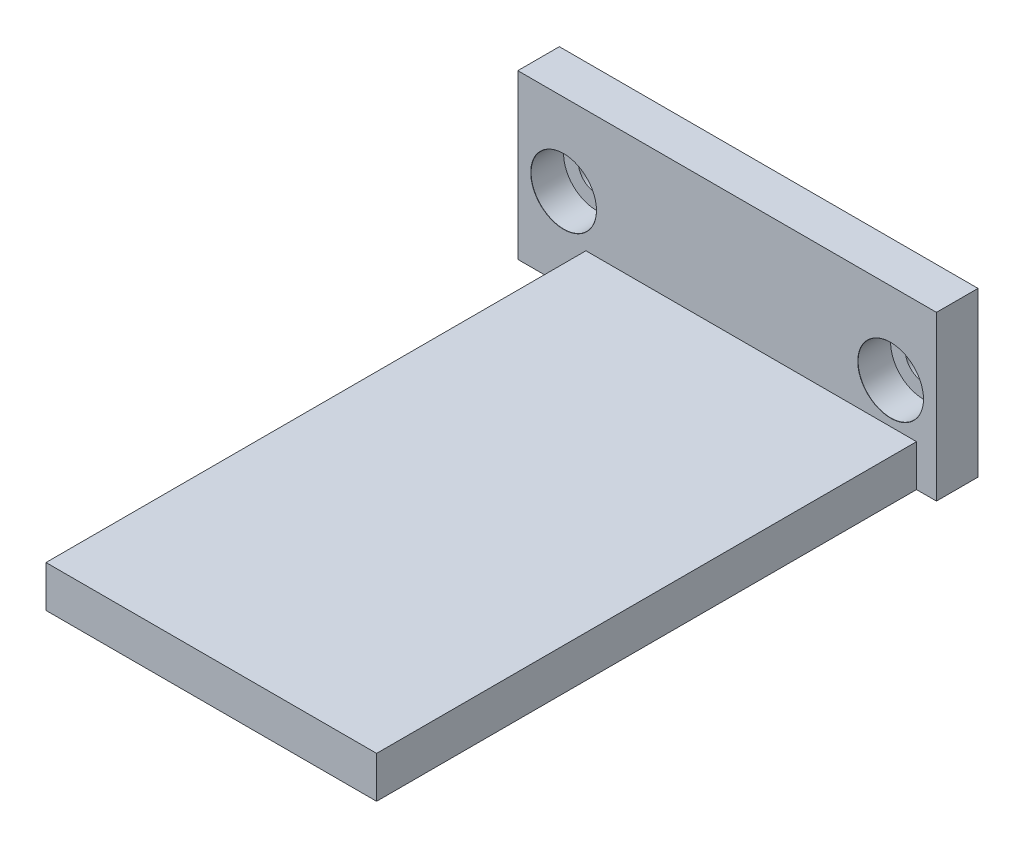
ISO-10303-21;
HEADER;
FILE_DESCRIPTION(('STEP AP214'),'2;1');
FILE_NAME('part.step','',(''),(''),'','','');
FILE_SCHEMA(('AUTOMOTIVE_DESIGN { 1 0 10303 214 1 1 1 1 }'));
ENDSEC;
DATA;
#1=APPLICATION_CONTEXT('core data for automotive mechanical design processes');
#2=APPLICATION_PROTOCOL_DEFINITION('international standard','automotive_design',2000,#1);
#3=PRODUCT_CONTEXT('',#1,'mechanical');
#4=PRODUCT('Part','Part','',(#3));
#5=PRODUCT_RELATED_PRODUCT_CATEGORY('part','',(#4));
#6=PRODUCT_DEFINITION_FORMATION('','',#4);
#7=PRODUCT_DEFINITION_CONTEXT('part definition',#1,'design');
#8=PRODUCT_DEFINITION('design','',#6,#7);
#9=PRODUCT_DEFINITION_SHAPE('','',#8);
#10=(LENGTH_UNIT() NAMED_UNIT(*) SI_UNIT(.MILLI.,.METRE.));
#11=(NAMED_UNIT(*) PLANE_ANGLE_UNIT() SI_UNIT($,.RADIAN.));
#12=(NAMED_UNIT(*) SI_UNIT($,.STERADIAN.) SOLID_ANGLE_UNIT());
#13=UNCERTAINTY_MEASURE_WITH_UNIT(LENGTH_MEASURE(1.E-05),#10,'distance_accuracy_value','');
#14=(GEOMETRIC_REPRESENTATION_CONTEXT(3) GLOBAL_UNCERTAINTY_ASSIGNED_CONTEXT((#13)) GLOBAL_UNIT_ASSIGNED_CONTEXT((#10,
#11,#12)) REPRESENTATION_CONTEXT('',''));
#15=CARTESIAN_POINT('',(0.,0.,0.));
#16=DIRECTION('',(0.,0.,1.));
#17=DIRECTION('',(1.,0.,0.));
#18=AXIS2_PLACEMENT_3D('',#15,#16,#17);
#19=CARTESIAN_POINT('',(0.,0.,6.35));
#20=DIRECTION('',(0.,0.,-1.));
#21=DIRECTION('',(-1.,0.,0.));
#22=AXIS2_PLACEMENT_3D('',#19,#20,#21);
#23=PLANE('',#22);
#24=CARTESIAN_POINT('',(7.,12.5,6.35));
#25=DIRECTION('',(0.,0.,1.));
#26=DIRECTION('',(1.,0.,0.));
#27=AXIS2_PLACEMENT_3D('',#24,#25,#26);
#28=CIRCLE('',#27,5.025);
#29=CARTESIAN_POINT('',(12.025,12.5,6.35));
#30=VERTEX_POINT('',#29);
#31=EDGE_CURVE('E177',#30,#30,#28,.T.);
#32=ORIENTED_EDGE('',*,*,#31,.F.);
#33=EDGE_LOOP('',(#32));
#34=FACE_BOUND('',#33,.T.);
#35=CARTESIAN_POINT('',(57.,12.5,6.35));
#36=DIRECTION('',(0.,0.,1.));
#37=DIRECTION('',(1.,0.,0.));
#38=AXIS2_PLACEMENT_3D('',#35,#36,#37);
#39=CIRCLE('',#38,5.025);
#40=CARTESIAN_POINT('',(62.025,12.5,6.35));
#41=VERTEX_POINT('',#40);
#42=EDGE_CURVE('E162',#41,#41,#39,.T.);
#43=ORIENTED_EDGE('',*,*,#42,.F.);
#44=EDGE_LOOP('',(#43));
#45=FACE_BOUND('',#44,.T.);
#46=DIRECTION('',(-1.,0.,0.));
#47=VECTOR('',#46,1.);
#48=CARTESIAN_POINT('',(0.,6.35,6.35));
#49=LINE('',#48,#47);
#50=CARTESIAN_POINT('',(60.96,6.35,6.35));
#51=VERTEX_POINT('',#50);
#52=CARTESIAN_POINT('',(10.414,6.35,6.35));
#53=VERTEX_POINT('',#52);
#54=EDGE_CURVE('E144',#51,#53,#49,.T.);
#55=ORIENTED_EDGE('',*,*,#54,.F.);
#56=DIRECTION('',(0.,1.,0.));
#57=VECTOR('',#56,1.);
#58=CARTESIAN_POINT('',(60.96,0.,6.35));
#59=LINE('',#58,#57);
#60=CARTESIAN_POINT('',(60.96,0.,6.35));
#61=VERTEX_POINT('',#60);
#62=EDGE_CURVE('E118',#61,#51,#59,.T.);
#63=ORIENTED_EDGE('',*,*,#62,.F.);
#64=DIRECTION('',(-1.,0.,0.));
#65=VECTOR('',#64,1.);
#66=CARTESIAN_POINT('',(64.008,0.,6.35));
#67=LINE('',#66,#65);
#68=CARTESIAN_POINT('',(64.008,0.,6.35));
#69=VERTEX_POINT('',#68);
#70=EDGE_CURVE('E116',#69,#61,#67,.T.);
#71=ORIENTED_EDGE('',*,*,#70,.F.);
#72=DIRECTION('',(0.,1.,0.));
#73=VECTOR('',#72,1.);
#74=CARTESIAN_POINT('',(64.008,0.,6.35));
#75=LINE('',#74,#73);
#76=CARTESIAN_POINT('',(64.008,24.9936,6.35));
#77=VERTEX_POINT('',#76);
#78=EDGE_CURVE('E103',#69,#77,#75,.T.);
#79=ORIENTED_EDGE('',*,*,#78,.T.);
#80=DIRECTION('',(-1.,0.,0.));
#81=VECTOR('',#80,1.);
#82=CARTESIAN_POINT('',(0.,24.9936,6.35));
#83=LINE('',#82,#81);
#84=CARTESIAN_POINT('',(0.,24.9936,6.35));
#85=VERTEX_POINT('',#84);
#86=EDGE_CURVE('E112',#77,#85,#83,.T.);
#87=ORIENTED_EDGE('',*,*,#86,.T.);
#88=DIRECTION('',(0.,-1.,0.));
#89=VECTOR('',#88,1.);
#90=CARTESIAN_POINT('',(0.,0.,6.35));
#91=LINE('',#90,#89);
#92=CARTESIAN_POINT('',(0.,0.,6.35));
#93=VERTEX_POINT('',#92);
#94=EDGE_CURVE('E113',#85,#93,#91,.T.);
#95=ORIENTED_EDGE('',*,*,#94,.T.);
#96=DIRECTION('',(-1.,0.,0.));
#97=VECTOR('',#96,1.);
#98=CARTESIAN_POINT('',(0.,0.,6.35));
#99=LINE('',#98,#97);
#100=CARTESIAN_POINT('',(10.414,0.,6.35));
#101=VERTEX_POINT('',#100);
#102=EDGE_CURVE('E183',#101,#93,#99,.T.);
#103=ORIENTED_EDGE('',*,*,#102,.F.);
#104=DIRECTION('',(0.,1.,0.));
#105=VECTOR('',#104,1.);
#106=CARTESIAN_POINT('',(10.414,0.,6.35));
#107=LINE('',#106,#105);
#108=EDGE_CURVE('E180',#101,#53,#107,.T.);
#109=ORIENTED_EDGE('',*,*,#108,.T.);
#110=EDGE_LOOP('',(#55,#63,#71,#79,#87,#95,#103,#109));
#111=FACE_BOUND('',#110,.T.);
#112=ADVANCED_FACE('F39',(#34,#45,#111),#23,.F.);
#113=CARTESIAN_POINT('',(0.,0.,6.35));
#114=DIRECTION('',(1.,0.,0.));
#115=DIRECTION('',(0.,0.,-1.));
#116=AXIS2_PLACEMENT_3D('',#113,#114,#115);
#117=PLANE('',#116);
#118=DIRECTION('',(0.,0.,-1.));
#119=VECTOR('',#118,1.);
#120=CARTESIAN_POINT('',(0.,0.,6.35));
#121=LINE('',#120,#119);
#122=CARTESIAN_POINT('',(0.,0.,0.));
#123=VERTEX_POINT('',#122);
#124=EDGE_CURVE('E11',#93,#123,#121,.T.);
#125=ORIENTED_EDGE('',*,*,#124,.F.);
#126=ORIENTED_EDGE('',*,*,#94,.F.);
#127=DIRECTION('',(0.,0.,-1.));
#128=VECTOR('',#127,1.);
#129=CARTESIAN_POINT('',(0.,24.9936,6.35));
#130=LINE('',#129,#128);
#131=CARTESIAN_POINT('',(0.,24.9936,0.));
#132=VERTEX_POINT('',#131);
#133=EDGE_CURVE('E128',#85,#132,#130,.T.);
#134=ORIENTED_EDGE('',*,*,#133,.T.);
#135=DIRECTION('',(0.,-1.,0.));
#136=VECTOR('',#135,1.);
#137=CARTESIAN_POINT('',(0.,0.,0.));
#138=LINE('',#137,#136);
#139=EDGE_CURVE('E138',#132,#123,#138,.T.);
#140=ORIENTED_EDGE('',*,*,#139,.T.);
#141=EDGE_LOOP('',(#125,#126,#134,#140));
#142=FACE_BOUND('',#141,.T.);
#143=ADVANCED_FACE('F41',(#142),#117,.F.);
#144=CARTESIAN_POINT('',(0.,0.,6.35));
#145=DIRECTION('',(0.,1.,0.));
#146=DIRECTION('',(0.,0.,1.));
#147=AXIS2_PLACEMENT_3D('',#144,#145,#146);
#148=PLANE('',#147);
#149=ORIENTED_EDGE('',*,*,#70,.T.);
#150=DIRECTION('',(0.,0.,1.));
#151=VECTOR('',#150,1.);
#152=CARTESIAN_POINT('',(60.96,0.,88.9));
#153=LINE('',#152,#151);
#154=CARTESIAN_POINT('',(60.96,0.,88.9));
#155=VERTEX_POINT('',#154);
#156=EDGE_CURVE('E122',#61,#155,#153,.T.);
#157=ORIENTED_EDGE('',*,*,#156,.T.);
#158=DIRECTION('',(1.,0.,0.));
#159=VECTOR('',#158,1.);
#160=CARTESIAN_POINT('',(0.,0.,88.9));
#161=LINE('',#160,#159);
#162=CARTESIAN_POINT('',(10.414,0.,88.9));
#163=VERTEX_POINT('',#162);
#164=EDGE_CURVE('E146',#163,#155,#161,.T.);
#165=ORIENTED_EDGE('',*,*,#164,.F.);
#166=DIRECTION('',(0.,0.,-1.));
#167=VECTOR('',#166,1.);
#168=CARTESIAN_POINT('',(10.414,0.,88.9));
#169=LINE('',#168,#167);
#170=EDGE_CURVE('E62',#163,#101,#169,.T.);
#171=ORIENTED_EDGE('',*,*,#170,.T.);
#172=ORIENTED_EDGE('',*,*,#102,.T.);
#173=ORIENTED_EDGE('',*,*,#124,.T.);
#174=DIRECTION('',(1.,0.,0.));
#175=VECTOR('',#174,1.);
#176=CARTESIAN_POINT('',(0.,0.,0.));
#177=LINE('',#176,#175);
#178=CARTESIAN_POINT('',(64.008,0.,0.));
#179=VERTEX_POINT('',#178);
#180=EDGE_CURVE('E126',#123,#179,#177,.T.);
#181=ORIENTED_EDGE('',*,*,#180,.T.);
#182=DIRECTION('',(0.,0.,-1.));
#183=VECTOR('',#182,1.);
#184=CARTESIAN_POINT('',(64.008,0.,6.35));
#185=LINE('',#184,#183);
#186=EDGE_CURVE('E47',#69,#179,#185,.T.);
#187=ORIENTED_EDGE('',*,*,#186,.F.);
#188=EDGE_LOOP('',(#149,#157,#165,#171,#172,#173,#181,#187));
#189=FACE_BOUND('',#188,.T.);
#190=ADVANCED_FACE('F124',(#189),#148,.F.);
#191=CARTESIAN_POINT('',(64.008,0.,6.35));
#192=DIRECTION('',(-1.,0.,0.));
#193=DIRECTION('',(0.,0.,1.));
#194=AXIS2_PLACEMENT_3D('',#191,#192,#193);
#195=PLANE('',#194);
#196=ORIENTED_EDGE('',*,*,#78,.F.);
#197=ORIENTED_EDGE('',*,*,#186,.T.);
#198=DIRECTION('',(0.,1.,0.));
#199=VECTOR('',#198,1.);
#200=CARTESIAN_POINT('',(64.008,0.,0.));
#201=LINE('',#200,#199);
#202=CARTESIAN_POINT('',(64.008,24.9936,0.));
#203=VERTEX_POINT('',#202);
#204=EDGE_CURVE('E135',#179,#203,#201,.T.);
#205=ORIENTED_EDGE('',*,*,#204,.T.);
#206=DIRECTION('',(0.,0.,-1.));
#207=VECTOR('',#206,1.);
#208=CARTESIAN_POINT('',(64.008,24.9936,6.35));
#209=LINE('',#208,#207);
#210=EDGE_CURVE('E109',#77,#203,#209,.T.);
#211=ORIENTED_EDGE('',*,*,#210,.F.);
#212=EDGE_LOOP('',(#196,#197,#205,#211));
#213=FACE_BOUND('',#212,.T.);
#214=ADVANCED_FACE('F105',(#213),#195,.F.);
#215=CARTESIAN_POINT('',(0.,24.9936,6.35));
#216=DIRECTION('',(0.,-1.,0.));
#217=DIRECTION('',(0.,0.,-1.));
#218=AXIS2_PLACEMENT_3D('',#215,#216,#217);
#219=PLANE('',#218);
#220=DIRECTION('',(-1.,0.,0.));
#221=VECTOR('',#220,1.);
#222=CARTESIAN_POINT('',(0.,24.9936,0.));
#223=LINE('',#222,#221);
#224=EDGE_CURVE('E133',#203,#132,#223,.T.);
#225=ORIENTED_EDGE('',*,*,#224,.T.);
#226=ORIENTED_EDGE('',*,*,#133,.F.);
#227=ORIENTED_EDGE('',*,*,#86,.F.);
#228=ORIENTED_EDGE('',*,*,#210,.T.);
#229=EDGE_LOOP('',(#225,#226,#227,#228));
#230=FACE_BOUND('',#229,.T.);
#231=ADVANCED_FACE('F214',(#230),#219,.F.);
#232=CARTESIAN_POINT('',(0.,0.,0.));
#233=DIRECTION('',(0.,0.,-1.));
#234=DIRECTION('',(-1.,0.,0.));
#235=AXIS2_PLACEMENT_3D('',#232,#233,#234);
#236=PLANE('',#235);
#237=CARTESIAN_POINT('',(7.,12.5,0.));
#238=DIRECTION('',(0.,0.,-1.));
#239=DIRECTION('',(-1.,0.,0.));
#240=AXIS2_PLACEMENT_3D('',#237,#238,#239);
#241=CIRCLE('',#240,2.75);
#242=CARTESIAN_POINT('',(4.25,12.5,0.));
#243=VERTEX_POINT('',#242);
#244=EDGE_CURVE('E165',#243,#243,#241,.T.);
#245=ORIENTED_EDGE('',*,*,#244,.F.);
#246=EDGE_LOOP('',(#245));
#247=FACE_BOUND('',#246,.T.);
#248=CARTESIAN_POINT('',(57.,12.5,0.));
#249=DIRECTION('',(0.,0.,-1.));
#250=DIRECTION('',(-1.,0.,0.));
#251=AXIS2_PLACEMENT_3D('',#248,#249,#250);
#252=CIRCLE('',#251,2.75);
#253=CARTESIAN_POINT('',(54.25,12.5,0.));
#254=VERTEX_POINT('',#253);
#255=EDGE_CURVE('E147',#254,#254,#252,.T.);
#256=ORIENTED_EDGE('',*,*,#255,.F.);
#257=EDGE_LOOP('',(#256));
#258=FACE_BOUND('',#257,.T.);
#259=ORIENTED_EDGE('',*,*,#139,.F.);
#260=ORIENTED_EDGE('',*,*,#224,.F.);
#261=ORIENTED_EDGE('',*,*,#204,.F.);
#262=ORIENTED_EDGE('',*,*,#180,.F.);
#263=EDGE_LOOP('',(#259,#260,#261,#262));
#264=FACE_BOUND('',#263,.T.);
#265=ADVANCED_FACE('F212',(#247,#258,#264),#236,.T.);
#266=CARTESIAN_POINT('',(0.,6.35,88.9));
#267=DIRECTION('',(0.,-1.,0.));
#268=DIRECTION('',(0.,0.,-1.));
#269=AXIS2_PLACEMENT_3D('',#266,#267,#268);
#270=PLANE('',#269);
#271=DIRECTION('',(-1.,0.,0.));
#272=VECTOR('',#271,1.);
#273=CARTESIAN_POINT('',(0.,6.35,88.9));
#274=LINE('',#273,#272);
#275=CARTESIAN_POINT('',(60.96,6.35,88.9));
#276=VERTEX_POINT('',#275);
#277=CARTESIAN_POINT('',(10.414,6.35,88.9));
#278=VERTEX_POINT('',#277);
#279=EDGE_CURVE('E141',#276,#278,#274,.T.);
#280=ORIENTED_EDGE('',*,*,#279,.F.);
#281=DIRECTION('',(0.,0.,1.));
#282=VECTOR('',#281,1.);
#283=CARTESIAN_POINT('',(60.96,6.35,88.9));
#284=LINE('',#283,#282);
#285=EDGE_CURVE('E54',#51,#276,#284,.T.);
#286=ORIENTED_EDGE('',*,*,#285,.F.);
#287=ORIENTED_EDGE('',*,*,#54,.T.);
#288=DIRECTION('',(0.,0.,-1.));
#289=VECTOR('',#288,1.);
#290=CARTESIAN_POINT('',(10.414,6.35,88.9));
#291=LINE('',#290,#289);
#292=EDGE_CURVE('E186',#278,#53,#291,.T.);
#293=ORIENTED_EDGE('',*,*,#292,.F.);
#294=EDGE_LOOP('',(#280,#286,#287,#293));
#295=FACE_BOUND('',#294,.T.);
#296=ADVANCED_FACE('F203',(#295),#270,.F.);
#297=CARTESIAN_POINT('',(0.,0.,88.9));
#298=DIRECTION('',(0.,0.,-1.));
#299=DIRECTION('',(-1.,0.,0.));
#300=AXIS2_PLACEMENT_3D('',#297,#298,#299);
#301=PLANE('',#300);
#302=ORIENTED_EDGE('',*,*,#164,.T.);
#303=DIRECTION('',(0.,1.,0.));
#304=VECTOR('',#303,1.);
#305=CARTESIAN_POINT('',(60.96,0.,88.9));
#306=LINE('',#305,#304);
#307=EDGE_CURVE('E189',#155,#276,#306,.T.);
#308=ORIENTED_EDGE('',*,*,#307,.T.);
#309=ORIENTED_EDGE('',*,*,#279,.T.);
#310=DIRECTION('',(0.,1.,0.));
#311=VECTOR('',#310,1.);
#312=CARTESIAN_POINT('',(10.414,0.,88.9));
#313=LINE('',#312,#311);
#314=EDGE_CURVE('E181',#163,#278,#313,.T.);
#315=ORIENTED_EDGE('',*,*,#314,.F.);
#316=EDGE_LOOP('',(#302,#308,#309,#315));
#317=FACE_BOUND('',#316,.T.);
#318=ADVANCED_FACE('F198',(#317),#301,.F.);
#319=CARTESIAN_POINT('',(57.,12.5,6.35));
#320=DIRECTION('',(0.,0.,1.));
#321=DIRECTION('',(1.,0.,0.));
#322=AXIS2_PLACEMENT_3D('',#319,#320,#321);
#323=CYLINDRICAL_SURFACE('',#322,2.75);
#324=CARTESIAN_POINT('',(57.,12.5,1.35));
#325=DIRECTION('',(0.,0.,1.));
#326=DIRECTION('',(1.,0.,0.));
#327=AXIS2_PLACEMENT_3D('',#324,#325,#326);
#328=CIRCLE('',#327,2.75);
#329=CARTESIAN_POINT('',(59.75,12.5,1.35));
#330=VERTEX_POINT('',#329);
#331=EDGE_CURVE('E153',#330,#330,#328,.T.);
#332=ORIENTED_EDGE('',*,*,#331,.T.);
#333=EDGE_LOOP('',(#332));
#334=FACE_BOUND('',#333,.T.);
#335=ORIENTED_EDGE('',*,*,#255,.T.);
#336=EDGE_LOOP('',(#335));
#337=FACE_BOUND('',#336,.T.);
#338=ADVANCED_FACE('F240',(#334,#337),#323,.F.);
#339=CARTESIAN_POINT('',(62.,12.5,1.35));
#340=DIRECTION('',(0.,0.,-1.));
#341=DIRECTION('',(-1.,0.,0.));
#342=AXIS2_PLACEMENT_3D('',#339,#340,#341);
#343=PLANE('',#342);
#344=ORIENTED_EDGE('',*,*,#331,.F.);
#345=EDGE_LOOP('',(#344));
#346=FACE_BOUND('',#345,.T.);
#347=CARTESIAN_POINT('',(57.,12.5,1.35));
#348=DIRECTION('',(0.,0.,1.));
#349=DIRECTION('',(1.,0.,0.));
#350=AXIS2_PLACEMENT_3D('',#347,#348,#349);
#351=CIRCLE('',#350,5.);
#352=CARTESIAN_POINT('',(62.,12.5,1.35));
#353=VERTEX_POINT('',#352);
#354=EDGE_CURVE('E156',#353,#353,#351,.T.);
#355=ORIENTED_EDGE('',*,*,#354,.T.);
#356=EDGE_LOOP('',(#355));
#357=FACE_BOUND('',#356,.T.);
#358=ADVANCED_FACE('F243',(#346,#357),#343,.F.);
#359=CARTESIAN_POINT('',(57.,12.5,6.35));
#360=DIRECTION('',(0.,0.,1.));
#361=DIRECTION('',(1.,0.,0.));
#362=AXIS2_PLACEMENT_3D('',#359,#360,#361);
#363=CYLINDRICAL_SURFACE('',#362,5.);
#364=ORIENTED_EDGE('',*,*,#354,.F.);
#365=EDGE_LOOP('',(#364));
#366=FACE_BOUND('',#365,.T.);
#367=CARTESIAN_POINT('',(57.,12.5,6.325));
#368=DIRECTION('',(0.,0.,1.));
#369=DIRECTION('',(1.,0.,0.));
#370=AXIS2_PLACEMENT_3D('',#367,#368,#369);
#371=CIRCLE('',#370,5.);
#372=CARTESIAN_POINT('',(62.,12.5,6.325));
#373=VERTEX_POINT('',#372);
#374=EDGE_CURVE('E159',#373,#373,#371,.T.);
#375=ORIENTED_EDGE('',*,*,#374,.T.);
#376=EDGE_LOOP('',(#375));
#377=FACE_BOUND('',#376,.T.);
#378=ADVANCED_FACE('F247',(#366,#377),#363,.F.);
#379=CARTESIAN_POINT('',(57.,12.5,6.35));
#380=DIRECTION('',(0.,0.,1.));
#381=DIRECTION('',(1.,0.,0.));
#382=AXIS2_PLACEMENT_3D('',#379,#380,#381);
#383=CONICAL_SURFACE('',#382,5.025,0.785398163397414);
#384=ORIENTED_EDGE('',*,*,#374,.F.);
#385=EDGE_LOOP('',(#384));
#386=FACE_BOUND('',#385,.T.);
#387=ORIENTED_EDGE('',*,*,#42,.T.);
#388=EDGE_LOOP('',(#387));
#389=FACE_BOUND('',#388,.T.);
#390=ADVANCED_FACE('F251',(#386,#389),#383,.F.);
#391=CARTESIAN_POINT('',(7.,12.5,6.35));
#392=DIRECTION('',(0.,0.,1.));
#393=DIRECTION('',(1.,0.,0.));
#394=AXIS2_PLACEMENT_3D('',#391,#392,#393);
#395=CYLINDRICAL_SURFACE('',#394,2.75);
#396=CARTESIAN_POINT('',(7.,12.5,1.35));
#397=DIRECTION('',(0.,0.,1.));
#398=DIRECTION('',(1.,0.,0.));
#399=AXIS2_PLACEMENT_3D('',#396,#397,#398);
#400=CIRCLE('',#399,2.75);
#401=CARTESIAN_POINT('',(9.75,12.5,1.35));
#402=VERTEX_POINT('',#401);
#403=EDGE_CURVE('E168',#402,#402,#400,.T.);
#404=ORIENTED_EDGE('',*,*,#403,.T.);
#405=EDGE_LOOP('',(#404));
#406=FACE_BOUND('',#405,.T.);
#407=ORIENTED_EDGE('',*,*,#244,.T.);
#408=EDGE_LOOP('',(#407));
#409=FACE_BOUND('',#408,.T.);
#410=ADVANCED_FACE('F255',(#406,#409),#395,.F.);
#411=CARTESIAN_POINT('',(12.,12.5,1.35));
#412=DIRECTION('',(0.,0.,-1.));
#413=DIRECTION('',(-1.,0.,0.));
#414=AXIS2_PLACEMENT_3D('',#411,#412,#413);
#415=PLANE('',#414);
#416=ORIENTED_EDGE('',*,*,#403,.F.);
#417=EDGE_LOOP('',(#416));
#418=FACE_BOUND('',#417,.T.);
#419=CARTESIAN_POINT('',(7.,12.5,1.35));
#420=DIRECTION('',(0.,0.,1.));
#421=DIRECTION('',(1.,0.,0.));
#422=AXIS2_PLACEMENT_3D('',#419,#420,#421);
#423=CIRCLE('',#422,5.);
#424=CARTESIAN_POINT('',(12.,12.5,1.35));
#425=VERTEX_POINT('',#424);
#426=EDGE_CURVE('E171',#425,#425,#423,.T.);
#427=ORIENTED_EDGE('',*,*,#426,.T.);
#428=EDGE_LOOP('',(#427));
#429=FACE_BOUND('',#428,.T.);
#430=ADVANCED_FACE('F259',(#418,#429),#415,.F.);
#431=CARTESIAN_POINT('',(7.,12.5,6.35));
#432=DIRECTION('',(0.,0.,1.));
#433=DIRECTION('',(1.,0.,0.));
#434=AXIS2_PLACEMENT_3D('',#431,#432,#433);
#435=CYLINDRICAL_SURFACE('',#434,5.);
#436=ORIENTED_EDGE('',*,*,#426,.F.);
#437=EDGE_LOOP('',(#436));
#438=FACE_BOUND('',#437,.T.);
#439=CARTESIAN_POINT('',(7.,12.5,6.325));
#440=DIRECTION('',(0.,0.,1.));
#441=DIRECTION('',(1.,0.,0.));
#442=AXIS2_PLACEMENT_3D('',#439,#440,#441);
#443=CIRCLE('',#442,5.);
#444=CARTESIAN_POINT('',(12.,12.5,6.325));
#445=VERTEX_POINT('',#444);
#446=EDGE_CURVE('E174',#445,#445,#443,.T.);
#447=ORIENTED_EDGE('',*,*,#446,.T.);
#448=EDGE_LOOP('',(#447));
#449=FACE_BOUND('',#448,.T.);
#450=ADVANCED_FACE('F263',(#438,#449),#435,.F.);
#451=CARTESIAN_POINT('',(7.,12.5,6.35));
#452=DIRECTION('',(0.,0.,1.));
#453=DIRECTION('',(1.,0.,0.));
#454=AXIS2_PLACEMENT_3D('',#451,#452,#453);
#455=CONICAL_SURFACE('',#454,5.025,0.785398163397414);
#456=ORIENTED_EDGE('',*,*,#446,.F.);
#457=EDGE_LOOP('',(#456));
#458=FACE_BOUND('',#457,.T.);
#459=ORIENTED_EDGE('',*,*,#31,.T.);
#460=EDGE_LOOP('',(#459));
#461=FACE_BOUND('',#460,.T.);
#462=ADVANCED_FACE('F267',(#458,#461),#455,.F.);
#463=CARTESIAN_POINT('',(10.414,0.,88.9));
#464=DIRECTION('',(1.,0.,0.));
#465=DIRECTION('',(0.,0.,-1.));
#466=AXIS2_PLACEMENT_3D('',#463,#464,#465);
#467=PLANE('',#466);
#468=ORIENTED_EDGE('',*,*,#292,.T.);
#469=ORIENTED_EDGE('',*,*,#108,.F.);
#470=ORIENTED_EDGE('',*,*,#170,.F.);
#471=ORIENTED_EDGE('',*,*,#314,.T.);
#472=EDGE_LOOP('',(#468,#469,#470,#471));
#473=FACE_BOUND('',#472,.T.);
#474=ADVANCED_FACE('F201',(#473),#467,.F.);
#475=CARTESIAN_POINT('',(60.96,0.,88.9));
#476=DIRECTION('',(-1.,0.,0.));
#477=DIRECTION('',(0.,0.,1.));
#478=AXIS2_PLACEMENT_3D('',#475,#476,#477);
#479=PLANE('',#478);
#480=ORIENTED_EDGE('',*,*,#285,.T.);
#481=ORIENTED_EDGE('',*,*,#307,.F.);
#482=ORIENTED_EDGE('',*,*,#156,.F.);
#483=ORIENTED_EDGE('',*,*,#62,.T.);
#484=EDGE_LOOP('',(#480,#481,#482,#483));
#485=FACE_BOUND('',#484,.T.);
#486=ADVANCED_FACE('F273',(#485),#479,.F.);
#487=CLOSED_SHELL('',(#112,#143,#190,#214,#231,#265,#296,#318,#338,#358,#378,#390,#410,#430,
#450,#462,#474,#486));
#488=MANIFOLD_SOLID_BREP('B2',#487);
#489=ADVANCED_BREP_SHAPE_REPRESENTATION('',(#18,#488),#14);
#490=SHAPE_DEFINITION_REPRESENTATION(#9,#489);
ENDSEC;
END-ISO-10303-21;
